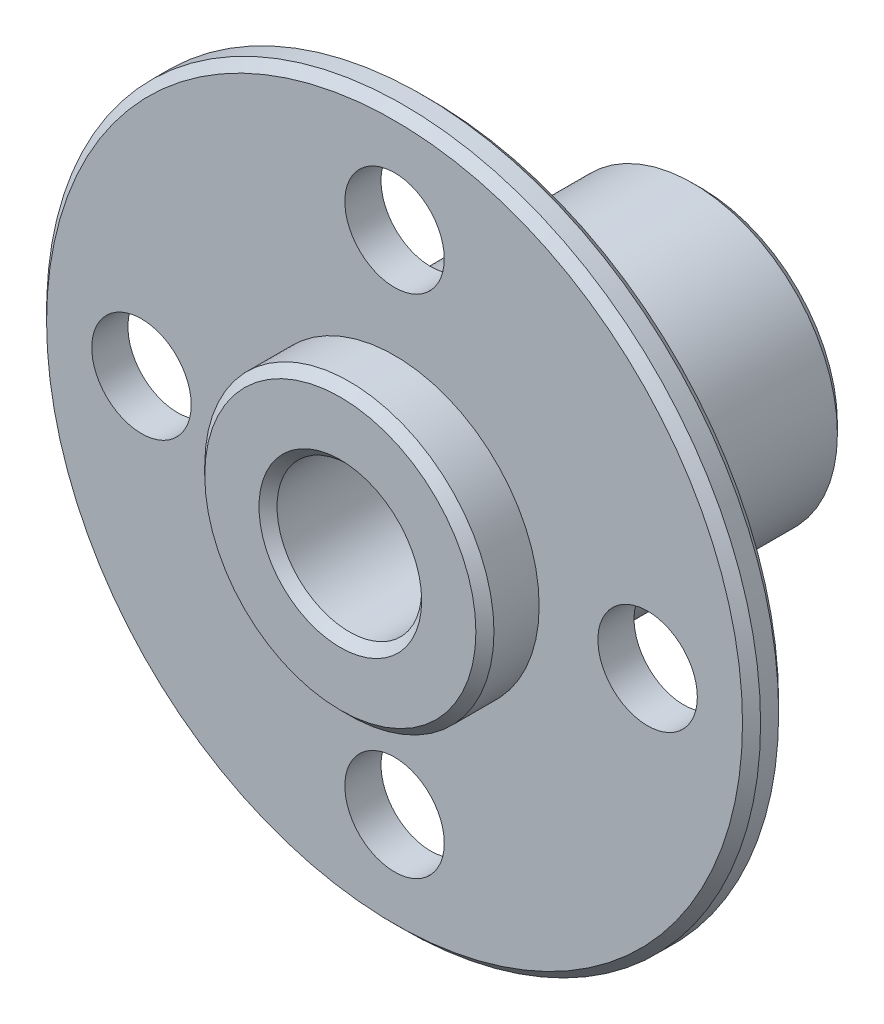
ISO-10303-21;
HEADER;
FILE_DESCRIPTION(('STEP AP214'),'2;1');
FILE_NAME('part.step','',(''),(''),'','','');
FILE_SCHEMA(('AUTOMOTIVE_DESIGN { 1 0 10303 214 1 1 1 1 }'));
ENDSEC;
DATA;
#1=APPLICATION_CONTEXT('core data for automotive mechanical design processes');
#2=APPLICATION_PROTOCOL_DEFINITION('international standard','automotive_design',2000,#1);
#3=PRODUCT_CONTEXT('',#1,'mechanical');
#4=PRODUCT('Part','Part','',(#3));
#5=PRODUCT_RELATED_PRODUCT_CATEGORY('part','',(#4));
#6=PRODUCT_DEFINITION_FORMATION('','',#4);
#7=PRODUCT_DEFINITION_CONTEXT('part definition',#1,'design');
#8=PRODUCT_DEFINITION('design','',#6,#7);
#9=PRODUCT_DEFINITION_SHAPE('','',#8);
#10=(LENGTH_UNIT() NAMED_UNIT(*) SI_UNIT(.MILLI.,.METRE.));
#11=(NAMED_UNIT(*) PLANE_ANGLE_UNIT() SI_UNIT($,.RADIAN.));
#12=(NAMED_UNIT(*) SI_UNIT($,.STERADIAN.) SOLID_ANGLE_UNIT());
#13=UNCERTAINTY_MEASURE_WITH_UNIT(LENGTH_MEASURE(1.E-05),#10,'distance_accuracy_value','');
#14=(GEOMETRIC_REPRESENTATION_CONTEXT(3) GLOBAL_UNCERTAINTY_ASSIGNED_CONTEXT((#13)) GLOBAL_UNIT_ASSIGNED_CONTEXT((#10,
#11,#12)) REPRESENTATION_CONTEXT('',''));
#15=CARTESIAN_POINT('',(0.,0.,0.));
#16=DIRECTION('',(0.,0.,1.));
#17=DIRECTION('',(1.,0.,0.));
#18=AXIS2_PLACEMENT_3D('',#15,#16,#17);
#19=CARTESIAN_POINT('',(0.,0.,0.));
#20=DIRECTION('',(0.,0.,1.));
#21=DIRECTION('',(1.,0.,0.));
#22=AXIS2_PLACEMENT_3D('',#19,#20,#21);
#23=PLANE('',#22);
#24=CARTESIAN_POINT('',(0.,0.,0.));
#25=DIRECTION('',(0.,0.,1.));
#26=DIRECTION('',(1.,0.,0.));
#27=AXIS2_PLACEMENT_3D('',#24,#25,#26);
#28=CIRCLE('',#27,19.25);
#29=CARTESIAN_POINT('',(19.25,0.,0.));
#30=VERTEX_POINT('',#29);
#31=EDGE_CURVE('E50',#30,#30,#28,.F.);
#32=ORIENTED_EDGE('',*,*,#31,.T.);
#33=EDGE_LOOP('',(#32));
#34=FACE_BOUND('',#33,.T.);
#35=CARTESIAN_POINT('',(0.,14.,0.));
#36=DIRECTION('',(0.,0.,1.));
#37=DIRECTION('',(1.,0.,0.));
#38=AXIS2_PLACEMENT_3D('',#35,#36,#37);
#39=CIRCLE('',#38,2.74999999999999);
#40=CARTESIAN_POINT('',(2.74999999999999,14.,0.));
#41=VERTEX_POINT('',#40);
#42=EDGE_CURVE('E98',#41,#41,#39,.T.);
#43=ORIENTED_EDGE('',*,*,#42,.T.);
#44=EDGE_LOOP('',(#43));
#45=FACE_BOUND('',#44,.T.);
#46=CARTESIAN_POINT('',(0.,-14.,0.));
#47=DIRECTION('',(0.,0.,1.));
#48=DIRECTION('',(1.,0.,0.));
#49=AXIS2_PLACEMENT_3D('',#46,#47,#48);
#50=CIRCLE('',#49,2.74999999999999);
#51=CARTESIAN_POINT('',(2.75,-14.,0.));
#52=VERTEX_POINT('',#51);
#53=EDGE_CURVE('E92',#52,#52,#50,.T.);
#54=ORIENTED_EDGE('',*,*,#53,.T.);
#55=EDGE_LOOP('',(#54));
#56=FACE_BOUND('',#55,.T.);
#57=CARTESIAN_POINT('',(-14.,0.,0.));
#58=DIRECTION('',(0.,0.,1.));
#59=DIRECTION('',(1.,0.,0.));
#60=AXIS2_PLACEMENT_3D('',#57,#58,#59);
#61=CIRCLE('',#60,2.74999999999999);
#62=CARTESIAN_POINT('',(-11.25,0.,0.));
#63=VERTEX_POINT('',#62);
#64=EDGE_CURVE('E86',#63,#63,#61,.T.);
#65=ORIENTED_EDGE('',*,*,#64,.T.);
#66=EDGE_LOOP('',(#65));
#67=FACE_BOUND('',#66,.T.);
#68=CARTESIAN_POINT('',(14.,0.,0.));
#69=DIRECTION('',(0.,0.,1.));
#70=DIRECTION('',(1.,0.,0.));
#71=AXIS2_PLACEMENT_3D('',#68,#69,#70);
#72=CIRCLE('',#71,2.74999999999999);
#73=CARTESIAN_POINT('',(16.75,0.,0.));
#74=VERTEX_POINT('',#73);
#75=EDGE_CURVE('E80',#74,#74,#72,.T.);
#76=ORIENTED_EDGE('',*,*,#75,.T.);
#77=EDGE_LOOP('',(#76));
#78=FACE_BOUND('',#77,.T.);
#79=CARTESIAN_POINT('',(0.,0.,0.));
#80=DIRECTION('',(0.,0.,1.));
#81=DIRECTION('',(1.,0.,0.));
#82=AXIS2_PLACEMENT_3D('',#79,#80,#81);
#83=CIRCLE('',#82,8.);
#84=CARTESIAN_POINT('',(8.,0.,0.));
#85=VERTEX_POINT('',#84);
#86=EDGE_CURVE('E74',#85,#85,#83,.F.);
#87=ORIENTED_EDGE('',*,*,#86,.F.);
#88=EDGE_LOOP('',(#87));
#89=FACE_BOUND('',#88,.T.);
#90=ADVANCED_FACE('F30',(#34,#45,#56,#67,#78,#89),#23,.F.);
#91=CARTESIAN_POINT('',(0.,0.,2.));
#92=DIRECTION('',(0.,0.,1.));
#93=DIRECTION('',(1.,0.,0.));
#94=AXIS2_PLACEMENT_3D('',#91,#92,#93);
#95=PLANE('',#94);
#96=CARTESIAN_POINT('',(0.,0.,2.));
#97=DIRECTION('',(0.,0.,1.));
#98=DIRECTION('',(1.,0.,0.));
#99=AXIS2_PLACEMENT_3D('',#96,#97,#98);
#100=CIRCLE('',#99,19.25);
#101=CARTESIAN_POINT('',(19.25,0.,2.));
#102=VERTEX_POINT('',#101);
#103=EDGE_CURVE('E45',#102,#102,#100,.T.);
#104=ORIENTED_EDGE('',*,*,#103,.T.);
#105=EDGE_LOOP('',(#104));
#106=FACE_BOUND('',#105,.T.);
#107=CARTESIAN_POINT('',(0.,14.,2.));
#108=DIRECTION('',(0.,0.,1.));
#109=DIRECTION('',(1.,0.,0.));
#110=AXIS2_PLACEMENT_3D('',#107,#108,#109);
#111=CIRCLE('',#110,2.74999999999999);
#112=CARTESIAN_POINT('',(2.74999999999999,14.,2.));
#113=VERTEX_POINT('',#112);
#114=EDGE_CURVE('E101',#113,#113,#111,.T.);
#115=ORIENTED_EDGE('',*,*,#114,.F.);
#116=EDGE_LOOP('',(#115));
#117=FACE_BOUND('',#116,.T.);
#118=CARTESIAN_POINT('',(0.,-14.,2.));
#119=DIRECTION('',(0.,0.,1.));
#120=DIRECTION('',(1.,0.,0.));
#121=AXIS2_PLACEMENT_3D('',#118,#119,#120);
#122=CIRCLE('',#121,2.74999999999999);
#123=CARTESIAN_POINT('',(2.74999999999999,-14.,2.));
#124=VERTEX_POINT('',#123);
#125=EDGE_CURVE('E95',#124,#124,#122,.T.);
#126=ORIENTED_EDGE('',*,*,#125,.F.);
#127=EDGE_LOOP('',(#126));
#128=FACE_BOUND('',#127,.T.);
#129=CARTESIAN_POINT('',(-14.,0.,2.));
#130=DIRECTION('',(0.,0.,1.));
#131=DIRECTION('',(1.,0.,0.));
#132=AXIS2_PLACEMENT_3D('',#129,#130,#131);
#133=CIRCLE('',#132,2.74999999999999);
#134=CARTESIAN_POINT('',(-11.25,0.,2.));
#135=VERTEX_POINT('',#134);
#136=EDGE_CURVE('E89',#135,#135,#133,.T.);
#137=ORIENTED_EDGE('',*,*,#136,.F.);
#138=EDGE_LOOP('',(#137));
#139=FACE_BOUND('',#138,.T.);
#140=CARTESIAN_POINT('',(14.,0.,2.));
#141=DIRECTION('',(0.,0.,1.));
#142=DIRECTION('',(1.,0.,0.));
#143=AXIS2_PLACEMENT_3D('',#140,#141,#142);
#144=CIRCLE('',#143,2.74999999999999);
#145=CARTESIAN_POINT('',(16.75,0.,2.));
#146=VERTEX_POINT('',#145);
#147=EDGE_CURVE('E83',#146,#146,#144,.T.);
#148=ORIENTED_EDGE('',*,*,#147,.F.);
#149=EDGE_LOOP('',(#148));
#150=FACE_BOUND('',#149,.T.);
#151=CARTESIAN_POINT('',(0.,0.,2.));
#152=DIRECTION('',(0.,0.,1.));
#153=DIRECTION('',(1.,0.,0.));
#154=AXIS2_PLACEMENT_3D('',#151,#152,#153);
#155=CIRCLE('',#154,8.);
#156=CARTESIAN_POINT('',(8.,0.,2.));
#157=VERTEX_POINT('',#156);
#158=EDGE_CURVE('E77',#157,#157,#155,.T.);
#159=ORIENTED_EDGE('',*,*,#158,.F.);
#160=EDGE_LOOP('',(#159));
#161=FACE_BOUND('',#160,.T.);
#162=ADVANCED_FACE('F107',(#106,#117,#128,#139,#150,#161),#95,.T.);
#163=CARTESIAN_POINT('',(0.,0.,2.));
#164=DIRECTION('',(0.,0.,-1.));
#165=DIRECTION('',(-1.,0.,0.));
#166=AXIS2_PLACEMENT_3D('',#163,#164,#165);
#167=CYLINDRICAL_SURFACE('',#166,19.75);
#168=CARTESIAN_POINT('',(0.,0.,0.500000000000004));
#169=DIRECTION('',(0.,0.,1.));
#170=DIRECTION('',(1.,0.,0.));
#171=AXIS2_PLACEMENT_3D('',#168,#169,#170);
#172=CIRCLE('',#171,19.75);
#173=CARTESIAN_POINT('',(19.75,0.,0.500000000000004));
#174=VERTEX_POINT('',#173);
#175=EDGE_CURVE('E53',#174,#174,#172,.T.);
#176=ORIENTED_EDGE('',*,*,#175,.T.);
#177=EDGE_LOOP('',(#176));
#178=FACE_BOUND('',#177,.T.);
#179=CARTESIAN_POINT('',(0.,0.,1.49999999999999));
#180=DIRECTION('',(0.,0.,1.));
#181=DIRECTION('',(1.,0.,0.));
#182=AXIS2_PLACEMENT_3D('',#179,#180,#181);
#183=CIRCLE('',#182,19.75);
#184=CARTESIAN_POINT('',(19.75,0.,1.49999999999999));
#185=VERTEX_POINT('',#184);
#186=EDGE_CURVE('E56',#185,#185,#183,.F.);
#187=ORIENTED_EDGE('',*,*,#186,.T.);
#188=EDGE_LOOP('',(#187));
#189=FACE_BOUND('',#188,.T.);
#190=ADVANCED_FACE('F110',(#178,#189),#167,.T.);
#191=CARTESIAN_POINT('',(0.,0.,5.));
#192=DIRECTION('',(0.,0.,-1.));
#193=DIRECTION('',(-1.,0.,0.));
#194=AXIS2_PLACEMENT_3D('',#191,#192,#193);
#195=CYLINDRICAL_SURFACE('',#194,8.);
#196=CARTESIAN_POINT('',(0.,0.,4.50000000000001));
#197=DIRECTION('',(0.,0.,1.));
#198=DIRECTION('',(1.,0.,0.));
#199=AXIS2_PLACEMENT_3D('',#196,#197,#198);
#200=CIRCLE('',#199,8.);
#201=CARTESIAN_POINT('',(8.,0.,4.50000000000001));
#202=VERTEX_POINT('',#201);
#203=EDGE_CURVE('E10',#202,#202,#200,.F.);
#204=ORIENTED_EDGE('',*,*,#203,.T.);
#205=EDGE_LOOP('',(#204));
#206=FACE_BOUND('',#205,.T.);
#207=ORIENTED_EDGE('',*,*,#158,.T.);
#208=EDGE_LOOP('',(#207));
#209=FACE_BOUND('',#208,.T.);
#210=ADVANCED_FACE('F121',(#206,#209),#195,.T.);
#211=CARTESIAN_POINT('',(0.,0.,5.));
#212=DIRECTION('',(0.,0.,1.));
#213=DIRECTION('',(1.,0.,0.));
#214=AXIS2_PLACEMENT_3D('',#211,#212,#213);
#215=PLANE('',#214);
#216=CARTESIAN_POINT('',(0.,0.,5.));
#217=DIRECTION('',(0.,0.,1.));
#218=DIRECTION('',(1.,0.,0.));
#219=AXIS2_PLACEMENT_3D('',#216,#217,#218);
#220=CIRCLE('',#219,4.5);
#221=CARTESIAN_POINT('',(4.5,0.,5.));
#222=VERTEX_POINT('',#221);
#223=EDGE_CURVE('E37',#222,#222,#220,.F.);
#224=ORIENTED_EDGE('',*,*,#223,.T.);
#225=EDGE_LOOP('',(#224));
#226=FACE_BOUND('',#225,.T.);
#227=CARTESIAN_POINT('',(0.,0.,5.));
#228=DIRECTION('',(0.,0.,1.));
#229=DIRECTION('',(1.,0.,0.));
#230=AXIS2_PLACEMENT_3D('',#227,#228,#229);
#231=CIRCLE('',#230,7.50000000000001);
#232=CARTESIAN_POINT('',(7.50000000000001,0.,5.));
#233=VERTEX_POINT('',#232);
#234=EDGE_CURVE('E41',#233,#233,#231,.T.);
#235=ORIENTED_EDGE('',*,*,#234,.T.);
#236=EDGE_LOOP('',(#235));
#237=FACE_BOUND('',#236,.T.);
#238=ADVANCED_FACE('F123',(#226,#237),#215,.T.);
#239=CARTESIAN_POINT('',(0.,0.,-15.));
#240=DIRECTION('',(0.,0.,1.));
#241=DIRECTION('',(1.,0.,0.));
#242=AXIS2_PLACEMENT_3D('',#239,#240,#241);
#243=CYLINDRICAL_SURFACE('',#242,8.);
#244=CARTESIAN_POINT('',(0.,0.,-14.5));
#245=DIRECTION('',(0.,0.,-1.));
#246=DIRECTION('',(-1.,0.,0.));
#247=AXIS2_PLACEMENT_3D('',#244,#245,#246);
#248=CIRCLE('',#247,8.);
#249=CARTESIAN_POINT('',(-8.,0.,-14.5));
#250=VERTEX_POINT('',#249);
#251=EDGE_CURVE('E59',#250,#250,#248,.F.);
#252=ORIENTED_EDGE('',*,*,#251,.T.);
#253=EDGE_LOOP('',(#252));
#254=FACE_BOUND('',#253,.T.);
#255=ORIENTED_EDGE('',*,*,#86,.T.);
#256=EDGE_LOOP('',(#255));
#257=FACE_BOUND('',#256,.T.);
#258=ADVANCED_FACE('F129',(#254,#257),#243,.T.);
#259=CARTESIAN_POINT('',(0.,0.,-15.));
#260=DIRECTION('',(0.,0.,-1.));
#261=DIRECTION('',(-1.,0.,0.));
#262=AXIS2_PLACEMENT_3D('',#259,#260,#261);
#263=PLANE('',#262);
#264=CARTESIAN_POINT('',(0.,0.,-15.));
#265=DIRECTION('',(0.,0.,-1.));
#266=DIRECTION('',(-1.,0.,0.));
#267=AXIS2_PLACEMENT_3D('',#264,#265,#266);
#268=CIRCLE('',#267,4.5);
#269=CARTESIAN_POINT('',(-4.5,0.,-15.));
#270=VERTEX_POINT('',#269);
#271=EDGE_CURVE('E62',#270,#270,#268,.F.);
#272=ORIENTED_EDGE('',*,*,#271,.T.);
#273=EDGE_LOOP('',(#272));
#274=FACE_BOUND('',#273,.T.);
#275=CARTESIAN_POINT('',(0.,0.,-15.));
#276=DIRECTION('',(0.,0.,-1.));
#277=DIRECTION('',(-1.,0.,0.));
#278=AXIS2_PLACEMENT_3D('',#275,#276,#277);
#279=CIRCLE('',#278,7.5);
#280=CARTESIAN_POINT('',(-7.5,0.,-15.));
#281=VERTEX_POINT('',#280);
#282=EDGE_CURVE('E65',#281,#281,#279,.T.);
#283=ORIENTED_EDGE('',*,*,#282,.T.);
#284=EDGE_LOOP('',(#283));
#285=FACE_BOUND('',#284,.T.);
#286=ADVANCED_FACE('F168',(#274,#285),#263,.T.);
#287=CARTESIAN_POINT('',(0.,0.,5.));
#288=DIRECTION('',(0.,0.,1.));
#289=DIRECTION('',(1.,0.,0.));
#290=AXIS2_PLACEMENT_3D('',#287,#288,#289);
#291=CYLINDRICAL_SURFACE('',#290,4.);
#292=CARTESIAN_POINT('',(0.,0.,-14.5));
#293=DIRECTION('',(0.,0.,-1.));
#294=DIRECTION('',(-1.,0.,0.));
#295=AXIS2_PLACEMENT_3D('',#292,#293,#294);
#296=CIRCLE('',#295,4.);
#297=CARTESIAN_POINT('',(-4.,0.,-14.5));
#298=VERTEX_POINT('',#297);
#299=EDGE_CURVE('E68',#298,#298,#296,.T.);
#300=ORIENTED_EDGE('',*,*,#299,.T.);
#301=EDGE_LOOP('',(#300));
#302=FACE_BOUND('',#301,.T.);
#303=CARTESIAN_POINT('',(0.,0.,4.50000000000001));
#304=DIRECTION('',(0.,0.,1.));
#305=DIRECTION('',(1.,0.,0.));
#306=AXIS2_PLACEMENT_3D('',#303,#304,#305);
#307=CIRCLE('',#306,4.);
#308=CARTESIAN_POINT('',(4.,0.,4.50000000000001));
#309=VERTEX_POINT('',#308);
#310=EDGE_CURVE('E71',#309,#309,#307,.T.);
#311=ORIENTED_EDGE('',*,*,#310,.T.);
#312=EDGE_LOOP('',(#311));
#313=FACE_BOUND('',#312,.T.);
#314=ADVANCED_FACE('F165',(#302,#313),#291,.F.);
#315=CARTESIAN_POINT('',(14.,0.,2.));
#316=DIRECTION('',(0.,0.,1.));
#317=DIRECTION('',(1.,0.,0.));
#318=AXIS2_PLACEMENT_3D('',#315,#316,#317);
#319=CYLINDRICAL_SURFACE('',#318,2.74999999999999);
#320=ORIENTED_EDGE('',*,*,#75,.F.);
#321=EDGE_LOOP('',(#320));
#322=FACE_BOUND('',#321,.T.);
#323=ORIENTED_EDGE('',*,*,#147,.T.);
#324=EDGE_LOOP('',(#323));
#325=FACE_BOUND('',#324,.T.);
#326=ADVANCED_FACE('F167',(#322,#325),#319,.F.);
#327=CARTESIAN_POINT('',(-14.,0.,2.));
#328=DIRECTION('',(0.,0.,1.));
#329=DIRECTION('',(1.,0.,0.));
#330=AXIS2_PLACEMENT_3D('',#327,#328,#329);
#331=CYLINDRICAL_SURFACE('',#330,2.74999999999999);
#332=ORIENTED_EDGE('',*,*,#64,.F.);
#333=EDGE_LOOP('',(#332));
#334=FACE_BOUND('',#333,.T.);
#335=ORIENTED_EDGE('',*,*,#136,.T.);
#336=EDGE_LOOP('',(#335));
#337=FACE_BOUND('',#336,.T.);
#338=ADVANCED_FACE('F175',(#334,#337),#331,.F.);
#339=CARTESIAN_POINT('',(0.,-14.,2.));
#340=DIRECTION('',(0.,0.,1.));
#341=DIRECTION('',(1.,0.,0.));
#342=AXIS2_PLACEMENT_3D('',#339,#340,#341);
#343=CYLINDRICAL_SURFACE('',#342,2.74999999999999);
#344=ORIENTED_EDGE('',*,*,#53,.F.);
#345=EDGE_LOOP('',(#344));
#346=FACE_BOUND('',#345,.T.);
#347=ORIENTED_EDGE('',*,*,#125,.T.);
#348=EDGE_LOOP('',(#347));
#349=FACE_BOUND('',#348,.T.);
#350=ADVANCED_FACE('F247',(#346,#349),#343,.F.);
#351=CARTESIAN_POINT('',(0.,14.,2.));
#352=DIRECTION('',(0.,0.,1.));
#353=DIRECTION('',(1.,0.,0.));
#354=AXIS2_PLACEMENT_3D('',#351,#352,#353);
#355=CYLINDRICAL_SURFACE('',#354,2.74999999999999);
#356=ORIENTED_EDGE('',*,*,#42,.F.);
#357=EDGE_LOOP('',(#356));
#358=FACE_BOUND('',#357,.T.);
#359=ORIENTED_EDGE('',*,*,#114,.T.);
#360=EDGE_LOOP('',(#359));
#361=FACE_BOUND('',#360,.T.);
#362=ADVANCED_FACE('F105',(#358,#361),#355,.F.);
#363=CARTESIAN_POINT('',(0.,0.,-14.5));
#364=DIRECTION('',(0.,0.,-1.));
#365=DIRECTION('',(-1.,0.,0.));
#366=AXIS2_PLACEMENT_3D('',#363,#364,#365);
#367=CONICAL_SURFACE('',#366,4.,0.785398163397455);
#368=ORIENTED_EDGE('',*,*,#271,.F.);
#369=EDGE_LOOP('',(#368));
#370=FACE_BOUND('',#369,.T.);
#371=ORIENTED_EDGE('',*,*,#299,.F.);
#372=EDGE_LOOP('',(#371));
#373=FACE_BOUND('',#372,.T.);
#374=ADVANCED_FACE('F140',(#370,#373),#367,.F.);
#375=CARTESIAN_POINT('',(0.,0.,-15.));
#376=DIRECTION('',(0.,0.,1.));
#377=DIRECTION('',(1.,0.,0.));
#378=AXIS2_PLACEMENT_3D('',#375,#376,#377);
#379=CONICAL_SURFACE('',#378,7.5,0.785398163397448);
#380=ORIENTED_EDGE('',*,*,#251,.F.);
#381=EDGE_LOOP('',(#380));
#382=FACE_BOUND('',#381,.T.);
#383=ORIENTED_EDGE('',*,*,#282,.F.);
#384=EDGE_LOOP('',(#383));
#385=FACE_BOUND('',#384,.T.);
#386=ADVANCED_FACE('F143',(#382,#385),#379,.T.);
#387=CARTESIAN_POINT('',(0.,0.,0.500000000000004));
#388=DIRECTION('',(0.,0.,1.));
#389=DIRECTION('',(1.,0.,0.));
#390=AXIS2_PLACEMENT_3D('',#387,#388,#389);
#391=CONICAL_SURFACE('',#390,19.75,0.785398163397452);
#392=ORIENTED_EDGE('',*,*,#31,.F.);
#393=EDGE_LOOP('',(#392));
#394=FACE_BOUND('',#393,.T.);
#395=ORIENTED_EDGE('',*,*,#175,.F.);
#396=EDGE_LOOP('',(#395));
#397=FACE_BOUND('',#396,.T.);
#398=ADVANCED_FACE('F147',(#394,#397),#391,.T.);
#399=CARTESIAN_POINT('',(0.,0.,2.));
#400=DIRECTION('',(0.,0.,-1.));
#401=DIRECTION('',(-1.,0.,0.));
#402=AXIS2_PLACEMENT_3D('',#399,#400,#401);
#403=CONICAL_SURFACE('',#402,19.25,0.785398163397438);
#404=ORIENTED_EDGE('',*,*,#186,.F.);
#405=EDGE_LOOP('',(#404));
#406=FACE_BOUND('',#405,.T.);
#407=ORIENTED_EDGE('',*,*,#103,.F.);
#408=EDGE_LOOP('',(#407));
#409=FACE_BOUND('',#408,.T.);
#410=ADVANCED_FACE('F151',(#406,#409),#403,.T.);
#411=CARTESIAN_POINT('',(0.,0.,4.50000000000001));
#412=DIRECTION('',(0.,0.,1.));
#413=DIRECTION('',(1.,0.,0.));
#414=AXIS2_PLACEMENT_3D('',#411,#412,#413);
#415=CONICAL_SURFACE('',#414,4.,0.785398163397455);
#416=ORIENTED_EDGE('',*,*,#223,.F.);
#417=EDGE_LOOP('',(#416));
#418=FACE_BOUND('',#417,.T.);
#419=ORIENTED_EDGE('',*,*,#310,.F.);
#420=EDGE_LOOP('',(#419));
#421=FACE_BOUND('',#420,.T.);
#422=ADVANCED_FACE('F154',(#418,#421),#415,.F.);
#423=CARTESIAN_POINT('',(0.,0.,5.));
#424=DIRECTION('',(0.,0.,-1.));
#425=DIRECTION('',(-1.,0.,0.));
#426=AXIS2_PLACEMENT_3D('',#423,#424,#425);
#427=CONICAL_SURFACE('',#426,7.50000000000001,0.785398163397448);
#428=ORIENTED_EDGE('',*,*,#203,.F.);
#429=EDGE_LOOP('',(#428));
#430=FACE_BOUND('',#429,.T.);
#431=ORIENTED_EDGE('',*,*,#234,.F.);
#432=EDGE_LOOP('',(#431));
#433=FACE_BOUND('',#432,.T.);
#434=ADVANCED_FACE('F32',(#430,#433),#427,.T.);
#435=CLOSED_SHELL('',(#90,#162,#190,#210,#238,#258,#286,#314,#326,#338,#350,#362,#374,#386,#398,
#410,#422,#434));
#436=MANIFOLD_SOLID_BREP('B2',#435);
#437=ADVANCED_BREP_SHAPE_REPRESENTATION('',(#18,#436),#14);
#438=SHAPE_DEFINITION_REPRESENTATION(#9,#437);
ENDSEC;
END-ISO-10303-21;
